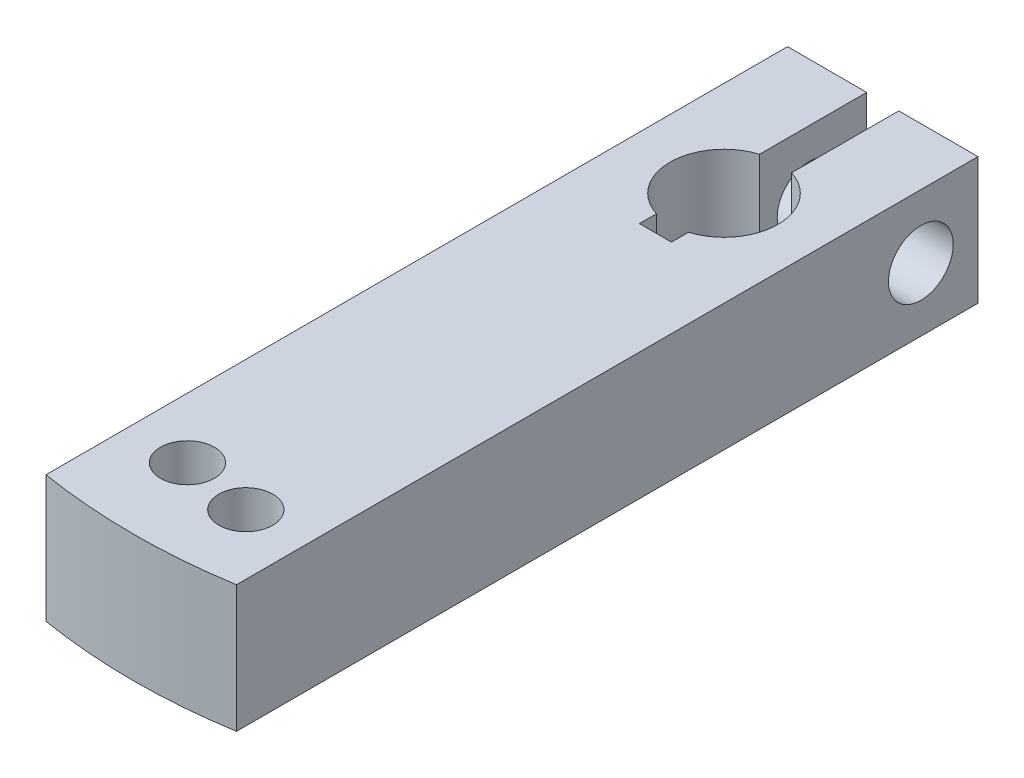
ISO-10303-21;
HEADER;
FILE_DESCRIPTION(('STEP AP214'),'2;1');
FILE_NAME('part.step','',(''),(''),'','','');
FILE_SCHEMA(('AUTOMOTIVE_DESIGN { 1 0 10303 214 1 1 1 1 }'));
ENDSEC;
DATA;
#1=APPLICATION_CONTEXT('core data for automotive mechanical design processes');
#2=APPLICATION_PROTOCOL_DEFINITION('international standard','automotive_design',2000,#1);
#3=PRODUCT_CONTEXT('',#1,'mechanical');
#4=PRODUCT('Part','Part','',(#3));
#5=PRODUCT_RELATED_PRODUCT_CATEGORY('part','',(#4));
#6=PRODUCT_DEFINITION_FORMATION('','',#4);
#7=PRODUCT_DEFINITION_CONTEXT('part definition',#1,'design');
#8=PRODUCT_DEFINITION('design','',#6,#7);
#9=PRODUCT_DEFINITION_SHAPE('','',#8);
#10=(LENGTH_UNIT() NAMED_UNIT(*) SI_UNIT(.MILLI.,.METRE.));
#11=(NAMED_UNIT(*) PLANE_ANGLE_UNIT() SI_UNIT($,.RADIAN.));
#12=(NAMED_UNIT(*) SI_UNIT($,.STERADIAN.) SOLID_ANGLE_UNIT());
#13=UNCERTAINTY_MEASURE_WITH_UNIT(LENGTH_MEASURE(1.E-05),#10,'distance_accuracy_value','');
#14=(GEOMETRIC_REPRESENTATION_CONTEXT(3) GLOBAL_UNCERTAINTY_ASSIGNED_CONTEXT((#13)) GLOBAL_UNIT_ASSIGNED_CONTEXT((#10,
#11,#12)) REPRESENTATION_CONTEXT('',''));
#15=CARTESIAN_POINT('',(0.,0.,0.));
#16=DIRECTION('',(0.,0.,1.));
#17=DIRECTION('',(1.,0.,0.));
#18=AXIS2_PLACEMENT_3D('',#15,#16,#17);
#19=CARTESIAN_POINT('',(15.0000000000022,-10.,-24.9999999999999));
#20=DIRECTION('',(-1.,0.,0.));
#21=DIRECTION('',(0.,0.,1.));
#22=AXIS2_PLACEMENT_3D('',#19,#20,#21);
#23=PLANE('',#22);
#24=CARTESIAN_POINT('',(15.0000000000018,0.,-15.9999999999996));
#25=DIRECTION('',(-1.,0.,0.));
#26=DIRECTION('',(0.,0.,1.));
#27=AXIS2_PLACEMENT_3D('',#24,#25,#26);
#28=CIRCLE('',#27,5.1);
#29=CARTESIAN_POINT('',(15.0000000000018,0.,-10.8999999999996));
#30=VERTEX_POINT('',#29);
#31=EDGE_CURVE('E139',#30,#30,#28,.T.);
#32=ORIENTED_EDGE('',*,*,#31,.T.);
#33=EDGE_LOOP('',(#32));
#34=FACE_BOUND('',#33,.T.);
#35=DIRECTION('',(0.,0.,1.));
#36=VECTOR('',#35,1.);
#37=CARTESIAN_POINT('',(15.0000000000022,10.,-24.9999999999999));
#38=LINE('',#37,#36);
#39=CARTESIAN_POINT('',(15.0000000000022,10.,-24.9999999999999));
#40=VERTEX_POINT('',#39);
#41=CARTESIAN_POINT('',(15.0000000000019,9.9999999999999,91.7823512446701));
#42=VERTEX_POINT('',#41);
#43=EDGE_CURVE('E142',#40,#42,#38,.T.);
#44=ORIENTED_EDGE('',*,*,#43,.T.);
#45=DIRECTION('',(0.,1.,0.));
#46=VECTOR('',#45,1.);
#47=CARTESIAN_POINT('',(15.0000000000019,-10.0000000000001,91.7823512446701));
#48=LINE('',#47,#46);
#49=CARTESIAN_POINT('',(15.0000000000019,-10.0000000000001,91.7823512446701));
#50=VERTEX_POINT('',#49);
#51=EDGE_CURVE('E11',#50,#42,#48,.T.);
#52=ORIENTED_EDGE('',*,*,#51,.F.);
#53=DIRECTION('',(0.,0.,1.));
#54=VECTOR('',#53,1.);
#55=CARTESIAN_POINT('',(15.0000000000022,-10.,-24.9999999999999));
#56=LINE('',#55,#54);
#57=CARTESIAN_POINT('',(15.0000000000022,-10.,-24.9999999999999));
#58=VERTEX_POINT('',#57);
#59=EDGE_CURVE('E176',#58,#50,#56,.T.);
#60=ORIENTED_EDGE('',*,*,#59,.F.);
#61=DIRECTION('',(0.,1.,0.));
#62=VECTOR('',#61,1.);
#63=CARTESIAN_POINT('',(15.0000000000022,-10.,-24.9999999999999));
#64=LINE('',#63,#62);
#65=EDGE_CURVE('E201',#58,#40,#64,.T.);
#66=ORIENTED_EDGE('',*,*,#65,.T.);
#67=EDGE_LOOP('',(#44,#52,#60,#66));
#68=FACE_BOUND('',#67,.T.);
#69=ADVANCED_FACE('F16',(#34,#68),#23,.F.);
#70=CARTESIAN_POINT('',(-1.11022302462516E-13,-10.,0.));
#71=DIRECTION('',(0.,1.,0.));
#72=DIRECTION('',(0.,0.,1.));
#73=AXIS2_PLACEMENT_3D('',#70,#71,#72);
#74=CYLINDRICAL_SURFACE('',#73,93.);
#75=CARTESIAN_POINT('',(-1.11022302462516E-13,10.,0.));
#76=DIRECTION('',(0.,-1.,0.));
#77=DIRECTION('',(1.,0.,0.));
#78=AXIS2_PLACEMENT_3D('',#75,#76,#77);
#79=CIRCLE('',#78,93.);
#80=CARTESIAN_POINT('',(-14.9999999999982,9.9999999999999,91.7823512446714));
#81=VERTEX_POINT('',#80);
#82=EDGE_CURVE('E143',#42,#81,#79,.T.);
#83=ORIENTED_EDGE('',*,*,#82,.T.);
#84=DIRECTION('',(0.,1.,0.));
#85=VECTOR('',#84,1.);
#86=CARTESIAN_POINT('',(-14.9999999999982,-10.0000000000001,91.7823512446714));
#87=LINE('',#86,#85);
#88=CARTESIAN_POINT('',(-14.9999999999982,-10.0000000000001,91.7823512446714));
#89=VERTEX_POINT('',#88);
#90=EDGE_CURVE('E24',#89,#81,#87,.T.);
#91=ORIENTED_EDGE('',*,*,#90,.F.);
#92=CARTESIAN_POINT('',(-1.11022302462516E-13,-10.,0.));
#93=DIRECTION('',(0.,-1.,0.));
#94=DIRECTION('',(1.,0.,0.));
#95=AXIS2_PLACEMENT_3D('',#92,#93,#94);
#96=CIRCLE('',#95,93.);
#97=EDGE_CURVE('E180',#50,#89,#96,.T.);
#98=ORIENTED_EDGE('',*,*,#97,.F.);
#99=ORIENTED_EDGE('',*,*,#51,.T.);
#100=EDGE_LOOP('',(#83,#91,#98,#99));
#101=FACE_BOUND('',#100,.T.);
#102=ADVANCED_FACE('F258',(#101),#74,.T.);
#103=CARTESIAN_POINT('',(-14.9999999999982,-10.,-24.9999999999999));
#104=DIRECTION('',(1.,0.,0.));
#105=DIRECTION('',(0.,0.,-1.));
#106=AXIS2_PLACEMENT_3D('',#103,#104,#105);
#107=PLANE('',#106);
#108=CARTESIAN_POINT('',(-14.999999999998,0.,-15.9999999999991));
#109=DIRECTION('',(1.,0.,0.));
#110=DIRECTION('',(0.,0.,-1.));
#111=AXIS2_PLACEMENT_3D('',#108,#109,#110);
#112=CIRCLE('',#111,5.1);
#113=CARTESIAN_POINT('',(-14.999999999998,0.,-21.0999999999991));
#114=VERTEX_POINT('',#113);
#115=EDGE_CURVE('E136',#114,#114,#112,.T.);
#116=ORIENTED_EDGE('',*,*,#115,.T.);
#117=EDGE_LOOP('',(#116));
#118=FACE_BOUND('',#117,.T.);
#119=DIRECTION('',(0.,0.,-1.));
#120=VECTOR('',#119,1.);
#121=CARTESIAN_POINT('',(-14.9999999999982,10.,-24.9999999999999));
#122=LINE('',#121,#120);
#123=CARTESIAN_POINT('',(-14.9999999999982,10.,-24.9999999999999));
#124=VERTEX_POINT('',#123);
#125=EDGE_CURVE('E146',#81,#124,#122,.T.);
#126=ORIENTED_EDGE('',*,*,#125,.T.);
#127=DIRECTION('',(0.,1.,0.));
#128=VECTOR('',#127,1.);
#129=CARTESIAN_POINT('',(-14.9999999999982,-10.,-24.9999999999999));
#130=LINE('',#129,#128);
#131=CARTESIAN_POINT('',(-14.9999999999982,-10.,-24.9999999999999));
#132=VERTEX_POINT('',#131);
#133=EDGE_CURVE('E229',#132,#124,#130,.T.);
#134=ORIENTED_EDGE('',*,*,#133,.F.);
#135=DIRECTION('',(0.,0.,-1.));
#136=VECTOR('',#135,1.);
#137=CARTESIAN_POINT('',(-14.9999999999982,-10.,-24.9999999999999));
#138=LINE('',#137,#136);
#139=EDGE_CURVE('E182',#89,#132,#138,.T.);
#140=ORIENTED_EDGE('',*,*,#139,.F.);
#141=ORIENTED_EDGE('',*,*,#90,.T.);
#142=EDGE_LOOP('',(#126,#134,#140,#141));
#143=FACE_BOUND('',#142,.T.);
#144=ADVANCED_FACE('F237',(#118,#143),#107,.F.);
#145=CARTESIAN_POINT('',(-14.9999999999982,-10.,-24.9999999999999));
#146=DIRECTION('',(0.,0.,1.));
#147=DIRECTION('',(1.,0.,0.));
#148=AXIS2_PLACEMENT_3D('',#145,#146,#147);
#149=PLANE('',#148);
#150=DIRECTION('',(1.,0.,0.));
#151=VECTOR('',#150,1.);
#152=CARTESIAN_POINT('',(-14.9999999999982,10.,-24.9999999999999));
#153=LINE('',#152,#151);
#154=CARTESIAN_POINT('',(-2.52500000000022,10.,-24.9999999999999));
#155=VERTEX_POINT('',#154);
#156=EDGE_CURVE('E149',#124,#155,#153,.T.);
#157=ORIENTED_EDGE('',*,*,#156,.T.);
#158=DIRECTION('',(0.,1.,0.));
#159=VECTOR('',#158,1.);
#160=CARTESIAN_POINT('',(-2.52500000000022,-9.99999999999995,-24.9999999999999));
#161=LINE('',#160,#159);
#162=CARTESIAN_POINT('',(-2.52500000000022,-9.99999999999995,-24.9999999999999));
#163=VERTEX_POINT('',#162);
#164=EDGE_CURVE('E226',#163,#155,#161,.T.);
#165=ORIENTED_EDGE('',*,*,#164,.F.);
#166=DIRECTION('',(1.,0.,0.));
#167=VECTOR('',#166,1.);
#168=CARTESIAN_POINT('',(-14.9999999999982,-10.,-24.9999999999999));
#169=LINE('',#168,#167);
#170=EDGE_CURVE('E184',#132,#163,#169,.T.);
#171=ORIENTED_EDGE('',*,*,#170,.F.);
#172=ORIENTED_EDGE('',*,*,#133,.T.);
#173=EDGE_LOOP('',(#157,#165,#171,#172));
#174=FACE_BOUND('',#173,.T.);
#175=ADVANCED_FACE('F248',(#174),#149,.F.);
#176=CARTESIAN_POINT('',(-2.52500000000022,-9.99999999999995,-24.9999999999999));
#177=DIRECTION('',(-1.,0.,0.));
#178=DIRECTION('',(0.,0.,1.));
#179=AXIS2_PLACEMENT_3D('',#176,#177,#178);
#180=PLANE('',#179);
#181=CARTESIAN_POINT('',(-2.525,0.,-15.9999999999991));
#182=DIRECTION('',(-1.,0.,0.));
#183=DIRECTION('',(0.,0.,1.));
#184=AXIS2_PLACEMENT_3D('',#181,#182,#183);
#185=CIRCLE('',#184,5.1);
#186=CARTESIAN_POINT('',(-2.52500000000001,0.,-10.8999999999991));
#187=VERTEX_POINT('',#186);
#188=EDGE_CURVE('E133',#187,#187,#185,.T.);
#189=ORIENTED_EDGE('',*,*,#188,.T.);
#190=EDGE_LOOP('',(#189));
#191=FACE_BOUND('',#190,.T.);
#192=DIRECTION('',(0.,0.,1.));
#193=VECTOR('',#192,1.);
#194=CARTESIAN_POINT('',(-2.52500000000022,10.,-24.9999999999999));
#195=LINE('',#194,#193);
#196=CARTESIAN_POINT('',(-2.525,10.,-8.11630303771338));
#197=VERTEX_POINT('',#196);
#198=EDGE_CURVE('E152',#155,#197,#195,.T.);
#199=ORIENTED_EDGE('',*,*,#198,.T.);
#200=DIRECTION('',(0.,1.,0.));
#201=VECTOR('',#200,1.);
#202=CARTESIAN_POINT('',(-2.525,-10.,-8.11630303771338));
#203=LINE('',#202,#201);
#204=CARTESIAN_POINT('',(-2.525,-10.,-8.11630303771338));
#205=VERTEX_POINT('',#204);
#206=EDGE_CURVE('E223',#205,#197,#203,.T.);
#207=ORIENTED_EDGE('',*,*,#206,.F.);
#208=DIRECTION('',(0.,0.,1.));
#209=VECTOR('',#208,1.);
#210=CARTESIAN_POINT('',(-2.52500000000022,-9.99999999999995,-24.9999999999999));
#211=LINE('',#210,#209);
#212=EDGE_CURVE('E186',#163,#205,#211,.T.);
#213=ORIENTED_EDGE('',*,*,#212,.F.);
#214=ORIENTED_EDGE('',*,*,#164,.T.);
#215=EDGE_LOOP('',(#199,#207,#213,#214));
#216=FACE_BOUND('',#215,.T.);
#217=ADVANCED_FACE('F252',(#191,#216),#180,.F.);
#218=CARTESIAN_POINT('',(-1.11022302462516E-13,-10.,0.));
#219=DIRECTION('',(0.,1.,0.));
#220=DIRECTION('',(0.,0.,1.));
#221=AXIS2_PLACEMENT_3D('',#218,#219,#220);
#222=CYLINDRICAL_SURFACE('',#221,8.5);
#223=CARTESIAN_POINT('',(-1.11022302462516E-13,10.,0.));
#224=DIRECTION('',(0.,1.,0.));
#225=DIRECTION('',(1.,0.,0.));
#226=AXIS2_PLACEMENT_3D('',#223,#224,#225);
#227=CIRCLE('',#226,8.5);
#228=CARTESIAN_POINT('',(-2.52500000000044,10.,8.11630303771427));
#229=VERTEX_POINT('',#228);
#230=EDGE_CURVE('E155',#197,#229,#227,.T.);
#231=ORIENTED_EDGE('',*,*,#230,.T.);
#232=DIRECTION('',(0.,1.,0.));
#233=VECTOR('',#232,1.);
#234=CARTESIAN_POINT('',(-2.52500000000044,-10.,8.11630303771427));
#235=LINE('',#234,#233);
#236=CARTESIAN_POINT('',(-2.52500000000044,-10.,8.11630303771427));
#237=VERTEX_POINT('',#236);
#238=EDGE_CURVE('E220',#237,#229,#235,.T.);
#239=ORIENTED_EDGE('',*,*,#238,.F.);
#240=CARTESIAN_POINT('',(-1.11022302462516E-13,-10.,0.));
#241=DIRECTION('',(0.,1.,0.));
#242=DIRECTION('',(1.,0.,0.));
#243=AXIS2_PLACEMENT_3D('',#240,#241,#242);
#244=CIRCLE('',#243,8.5);
#245=EDGE_CURVE('E188',#205,#237,#244,.T.);
#246=ORIENTED_EDGE('',*,*,#245,.F.);
#247=ORIENTED_EDGE('',*,*,#206,.T.);
#248=EDGE_LOOP('',(#231,#239,#246,#247));
#249=FACE_BOUND('',#248,.T.);
#250=ADVANCED_FACE('F289',(#249),#222,.F.);
#251=CARTESIAN_POINT('',(-2.52500000000033,-10.,10.8000000000001));
#252=DIRECTION('',(-1.,0.,0.));
#253=DIRECTION('',(0.,0.,1.));
#254=AXIS2_PLACEMENT_3D('',#251,#252,#253);
#255=PLANE('',#254);
#256=DIRECTION('',(0.,0.,1.));
#257=VECTOR('',#256,1.);
#258=CARTESIAN_POINT('',(-2.52500000000033,10.,10.8000000000001));
#259=LINE('',#258,#257);
#260=CARTESIAN_POINT('',(-2.52500000000033,10.,10.8000000000001));
#261=VERTEX_POINT('',#260);
#262=EDGE_CURVE('E158',#229,#261,#259,.T.);
#263=ORIENTED_EDGE('',*,*,#262,.T.);
#264=DIRECTION('',(0.,1.,0.));
#265=VECTOR('',#264,1.);
#266=CARTESIAN_POINT('',(-2.52500000000033,-10.,10.8000000000001));
#267=LINE('',#266,#265);
#268=CARTESIAN_POINT('',(-2.52500000000033,-10.,10.8000000000001));
#269=VERTEX_POINT('',#268);
#270=EDGE_CURVE('E217',#269,#261,#267,.T.);
#271=ORIENTED_EDGE('',*,*,#270,.F.);
#272=DIRECTION('',(0.,0.,1.));
#273=VECTOR('',#272,1.);
#274=CARTESIAN_POINT('',(-2.52500000000033,-10.,10.8000000000001));
#275=LINE('',#274,#273);
#276=EDGE_CURVE('E190',#237,#269,#275,.T.);
#277=ORIENTED_EDGE('',*,*,#276,.F.);
#278=ORIENTED_EDGE('',*,*,#238,.T.);
#279=EDGE_LOOP('',(#263,#271,#277,#278));
#280=FACE_BOUND('',#279,.T.);
#281=ADVANCED_FACE('F287',(#280),#255,.F.);
#282=CARTESIAN_POINT('',(-2.52500000000033,-10.,10.8000000000001));
#283=DIRECTION('',(0.,0.,1.));
#284=DIRECTION('',(1.,0.,0.));
#285=AXIS2_PLACEMENT_3D('',#282,#283,#284);
#286=PLANE('',#285);
#287=DIRECTION('',(1.,0.,0.));
#288=VECTOR('',#287,1.);
#289=CARTESIAN_POINT('',(-2.52500000000033,10.,10.8000000000001));
#290=LINE('',#289,#288);
#291=CARTESIAN_POINT('',(2.52499999999956,10.,10.800000000001));
#292=VERTEX_POINT('',#291);
#293=EDGE_CURVE('E161',#261,#292,#290,.T.);
#294=ORIENTED_EDGE('',*,*,#293,.T.);
#295=DIRECTION('',(0.,1.,0.));
#296=VECTOR('',#295,1.);
#297=CARTESIAN_POINT('',(2.52499999999956,-10.,10.800000000001));
#298=LINE('',#297,#296);
#299=CARTESIAN_POINT('',(2.52499999999956,-10.,10.800000000001));
#300=VERTEX_POINT('',#299);
#301=EDGE_CURVE('E214',#300,#292,#298,.T.);
#302=ORIENTED_EDGE('',*,*,#301,.F.);
#303=DIRECTION('',(1.,0.,0.));
#304=VECTOR('',#303,1.);
#305=CARTESIAN_POINT('',(-2.52500000000033,-10.,10.8000000000001));
#306=LINE('',#305,#304);
#307=EDGE_CURVE('E192',#269,#300,#306,.T.);
#308=ORIENTED_EDGE('',*,*,#307,.F.);
#309=ORIENTED_EDGE('',*,*,#270,.T.);
#310=EDGE_LOOP('',(#294,#302,#308,#309));
#311=FACE_BOUND('',#310,.T.);
#312=ADVANCED_FACE('F283',(#311),#286,.F.);
#313=CARTESIAN_POINT('',(2.52499999999956,-10.,10.800000000001));
#314=DIRECTION('',(1.,0.,0.));
#315=DIRECTION('',(0.,0.,-1.));
#316=AXIS2_PLACEMENT_3D('',#313,#314,#315);
#317=PLANE('',#316);
#318=DIRECTION('',(0.,0.,-1.));
#319=VECTOR('',#318,1.);
#320=CARTESIAN_POINT('',(2.52499999999956,10.,10.800000000001));
#321=LINE('',#320,#319);
#322=CARTESIAN_POINT('',(2.525,10.,8.11630303771427));
#323=VERTEX_POINT('',#322);
#324=EDGE_CURVE('E164',#292,#323,#321,.T.);
#325=ORIENTED_EDGE('',*,*,#324,.T.);
#326=DIRECTION('',(0.,1.,0.));
#327=VECTOR('',#326,1.);
#328=CARTESIAN_POINT('',(2.525,-10.,8.11630303771427));
#329=LINE('',#328,#327);
#330=CARTESIAN_POINT('',(2.525,-10.,8.11630303771427));
#331=VERTEX_POINT('',#330);
#332=EDGE_CURVE('E211',#331,#323,#329,.T.);
#333=ORIENTED_EDGE('',*,*,#332,.F.);
#334=DIRECTION('',(0.,0.,-1.));
#335=VECTOR('',#334,1.);
#336=CARTESIAN_POINT('',(2.52499999999956,-10.,10.800000000001));
#337=LINE('',#336,#335);
#338=EDGE_CURVE('E194',#300,#331,#337,.T.);
#339=ORIENTED_EDGE('',*,*,#338,.F.);
#340=ORIENTED_EDGE('',*,*,#301,.T.);
#341=EDGE_LOOP('',(#325,#333,#339,#340));
#342=FACE_BOUND('',#341,.T.);
#343=ADVANCED_FACE('F278',(#342),#317,.F.);
#344=CARTESIAN_POINT('',(-1.11022302462516E-13,-10.,0.));
#345=DIRECTION('',(0.,1.,0.));
#346=DIRECTION('',(0.,0.,1.));
#347=AXIS2_PLACEMENT_3D('',#344,#345,#346);
#348=CYLINDRICAL_SURFACE('',#347,8.5);
#349=CARTESIAN_POINT('',(-1.11022302462516E-13,10.,0.));
#350=DIRECTION('',(0.,1.,0.));
#351=DIRECTION('',(-1.,0.,0.));
#352=AXIS2_PLACEMENT_3D('',#349,#350,#351);
#353=CIRCLE('',#352,8.5);
#354=CARTESIAN_POINT('',(2.525,10.,-8.11630303771294));
#355=VERTEX_POINT('',#354);
#356=EDGE_CURVE('E167',#323,#355,#353,.T.);
#357=ORIENTED_EDGE('',*,*,#356,.T.);
#358=DIRECTION('',(0.,1.,0.));
#359=VECTOR('',#358,1.);
#360=CARTESIAN_POINT('',(2.525,-10.,-8.11630303771294));
#361=LINE('',#360,#359);
#362=CARTESIAN_POINT('',(2.525,-10.,-8.11630303771294));
#363=VERTEX_POINT('',#362);
#364=EDGE_CURVE('E208',#363,#355,#361,.T.);
#365=ORIENTED_EDGE('',*,*,#364,.F.);
#366=CARTESIAN_POINT('',(-1.11022302462516E-13,-10.,0.));
#367=DIRECTION('',(0.,1.,0.));
#368=DIRECTION('',(-1.,0.,0.));
#369=AXIS2_PLACEMENT_3D('',#366,#367,#368);
#370=CIRCLE('',#369,8.5);
#371=EDGE_CURVE('E196',#331,#363,#370,.T.);
#372=ORIENTED_EDGE('',*,*,#371,.F.);
#373=ORIENTED_EDGE('',*,*,#332,.T.);
#374=EDGE_LOOP('',(#357,#365,#372,#373));
#375=FACE_BOUND('',#374,.T.);
#376=ADVANCED_FACE('F272',(#375),#348,.F.);
#377=CARTESIAN_POINT('',(2.52499999999956,-10.,-24.9999999999995));
#378=DIRECTION('',(1.,0.,0.));
#379=DIRECTION('',(0.,0.,-1.));
#380=AXIS2_PLACEMENT_3D('',#377,#378,#379);
#381=PLANE('',#380);
#382=CARTESIAN_POINT('',(2.52499999999978,0.,-15.9999999999996));
#383=DIRECTION('',(1.,0.,0.));
#384=DIRECTION('',(0.,0.,-1.));
#385=AXIS2_PLACEMENT_3D('',#382,#383,#384);
#386=CIRCLE('',#385,5.1);
#387=CARTESIAN_POINT('',(2.52499999999979,0.,-21.0999999999996));
#388=VERTEX_POINT('',#387);
#389=EDGE_CURVE('E19',#388,#388,#386,.T.);
#390=ORIENTED_EDGE('',*,*,#389,.T.);
#391=EDGE_LOOP('',(#390));
#392=FACE_BOUND('',#391,.T.);
#393=DIRECTION('',(0.,0.,-1.));
#394=VECTOR('',#393,1.);
#395=CARTESIAN_POINT('',(2.52499999999956,10.,-24.9999999999995));
#396=LINE('',#395,#394);
#397=CARTESIAN_POINT('',(2.52499999999956,10.,-24.9999999999995));
#398=VERTEX_POINT('',#397);
#399=EDGE_CURVE('E170',#355,#398,#396,.T.);
#400=ORIENTED_EDGE('',*,*,#399,.T.);
#401=DIRECTION('',(0.,1.,0.));
#402=VECTOR('',#401,1.);
#403=CARTESIAN_POINT('',(2.52499999999956,-10.,-24.9999999999995));
#404=LINE('',#403,#402);
#405=CARTESIAN_POINT('',(2.52499999999956,-10.,-24.9999999999995));
#406=VERTEX_POINT('',#405);
#407=EDGE_CURVE('E205',#406,#398,#404,.T.);
#408=ORIENTED_EDGE('',*,*,#407,.F.);
#409=DIRECTION('',(0.,0.,-1.));
#410=VECTOR('',#409,1.);
#411=CARTESIAN_POINT('',(2.52499999999956,-10.,-24.9999999999995));
#412=LINE('',#411,#410);
#413=EDGE_CURVE('E198',#363,#406,#412,.T.);
#414=ORIENTED_EDGE('',*,*,#413,.F.);
#415=ORIENTED_EDGE('',*,*,#364,.T.);
#416=EDGE_LOOP('',(#400,#408,#414,#415));
#417=FACE_BOUND('',#416,.T.);
#418=ADVANCED_FACE('F268',(#392,#417),#381,.F.);
#419=CARTESIAN_POINT('',(2.52499999999956,-10.,-24.9999999999995));
#420=DIRECTION('',(0.,0.,1.));
#421=DIRECTION('',(1.,0.,0.));
#422=AXIS2_PLACEMENT_3D('',#419,#420,#421);
#423=PLANE('',#422);
#424=DIRECTION('',(1.,0.,0.));
#425=VECTOR('',#424,1.);
#426=CARTESIAN_POINT('',(2.52499999999956,10.,-24.9999999999995));
#427=LINE('',#426,#425);
#428=EDGE_CURVE('E173',#398,#40,#427,.T.);
#429=ORIENTED_EDGE('',*,*,#428,.T.);
#430=ORIENTED_EDGE('',*,*,#65,.F.);
#431=DIRECTION('',(1.,0.,0.));
#432=VECTOR('',#431,1.);
#433=CARTESIAN_POINT('',(2.52499999999956,-10.,-24.9999999999995));
#434=LINE('',#433,#432);
#435=EDGE_CURVE('E38',#406,#58,#434,.T.);
#436=ORIENTED_EDGE('',*,*,#435,.F.);
#437=ORIENTED_EDGE('',*,*,#407,.T.);
#438=EDGE_LOOP('',(#429,#430,#436,#437));
#439=FACE_BOUND('',#438,.T.);
#440=ADVANCED_FACE('F264',(#439),#423,.F.);
#441=CARTESIAN_POINT('',(-1.11022302462516E-13,-10.,0.));
#442=DIRECTION('',(0.,-1.,0.));
#443=DIRECTION('',(0.,0.,-1.));
#444=AXIS2_PLACEMENT_3D('',#441,#442,#443);
#445=PLANE('',#444);
#446=CARTESIAN_POINT('',(-5.50000000000006,-10.0000000000001,79.0087969785649));
#447=DIRECTION('',(0.,1.,0.));
#448=DIRECTION('',(0.,0.,1.));
#449=AXIS2_PLACEMENT_3D('',#446,#447,#448);
#450=CIRCLE('',#449,8.);
#451=CARTESIAN_POINT('',(0.928918912111443,-10.0000000000001,74.2475994798788));
#452=VERTEX_POINT('',#451);
#453=CARTESIAN_POINT('',(-0.928918912112109,-10.0000000000001,85.5742533745776));
#454=VERTEX_POINT('',#453);
#455=EDGE_CURVE('E30',#452,#454,#450,.T.);
#456=ORIENTED_EDGE('',*,*,#455,.T.);
#457=CARTESIAN_POINT('',(5.49999999999984,-10.0000000000001,80.8130558758919));
#458=DIRECTION('',(0.,1.,0.));
#459=DIRECTION('',(0.,0.,1.));
#460=AXIS2_PLACEMENT_3D('',#457,#458,#459);
#461=CIRCLE('',#460,8.);
#462=EDGE_CURVE('E118',#454,#452,#461,.T.);
#463=ORIENTED_EDGE('',*,*,#462,.T.);
#464=EDGE_LOOP('',(#456,#463));
#465=FACE_BOUND('',#464,.T.);
#466=ORIENTED_EDGE('',*,*,#59,.T.);
#467=ORIENTED_EDGE('',*,*,#97,.T.);
#468=ORIENTED_EDGE('',*,*,#139,.T.);
#469=ORIENTED_EDGE('',*,*,#170,.T.);
#470=ORIENTED_EDGE('',*,*,#212,.T.);
#471=ORIENTED_EDGE('',*,*,#245,.T.);
#472=ORIENTED_EDGE('',*,*,#276,.T.);
#473=ORIENTED_EDGE('',*,*,#307,.T.);
#474=ORIENTED_EDGE('',*,*,#338,.T.);
#475=ORIENTED_EDGE('',*,*,#371,.T.);
#476=ORIENTED_EDGE('',*,*,#413,.T.);
#477=ORIENTED_EDGE('',*,*,#435,.T.);
#478=EDGE_LOOP('',(#466,#467,#468,#469,#470,#471,#472,#473,#474,#475,#476,#477));
#479=FACE_BOUND('',#478,.T.);
#480=ADVANCED_FACE('F117',(#465,#479),#445,.T.);
#481=CARTESIAN_POINT('',(-1.11022302462516E-13,10.,0.));
#482=DIRECTION('',(0.,-1.,0.));
#483=DIRECTION('',(0.,0.,-1.));
#484=AXIS2_PLACEMENT_3D('',#481,#482,#483);
#485=PLANE('',#484);
#486=CARTESIAN_POINT('',(-5.50000000000006,9.9999999999999,79.0087969785649));
#487=DIRECTION('',(0.,-1.,0.));
#488=DIRECTION('',(0.,0.,-1.));
#489=AXIS2_PLACEMENT_3D('',#486,#487,#488);
#490=CIRCLE('',#489,4.25);
#491=CARTESIAN_POINT('',(-5.50000000000005,9.9999999999999,74.7587969785649));
#492=VERTEX_POINT('',#491);
#493=EDGE_CURVE('E114',#492,#492,#490,.T.);
#494=ORIENTED_EDGE('',*,*,#493,.T.);
#495=EDGE_LOOP('',(#494));
#496=FACE_BOUND('',#495,.T.);
#497=CARTESIAN_POINT('',(5.50000000000006,9.9999999999999,80.8130558758919));
#498=DIRECTION('',(0.,-1.,0.));
#499=DIRECTION('',(0.,0.,-1.));
#500=AXIS2_PLACEMENT_3D('',#497,#498,#499);
#501=CIRCLE('',#500,4.25);
#502=CARTESIAN_POINT('',(5.50000000000007,9.9999999999999,76.5630558758919));
#503=VERTEX_POINT('',#502);
#504=EDGE_CURVE('E123',#503,#503,#501,.T.);
#505=ORIENTED_EDGE('',*,*,#504,.T.);
#506=EDGE_LOOP('',(#505));
#507=FACE_BOUND('',#506,.T.);
#508=ORIENTED_EDGE('',*,*,#43,.F.);
#509=ORIENTED_EDGE('',*,*,#428,.F.);
#510=ORIENTED_EDGE('',*,*,#399,.F.);
#511=ORIENTED_EDGE('',*,*,#356,.F.);
#512=ORIENTED_EDGE('',*,*,#324,.F.);
#513=ORIENTED_EDGE('',*,*,#293,.F.);
#514=ORIENTED_EDGE('',*,*,#262,.F.);
#515=ORIENTED_EDGE('',*,*,#230,.F.);
#516=ORIENTED_EDGE('',*,*,#198,.F.);
#517=ORIENTED_EDGE('',*,*,#156,.F.);
#518=ORIENTED_EDGE('',*,*,#125,.F.);
#519=ORIENTED_EDGE('',*,*,#82,.F.);
#520=EDGE_LOOP('',(#508,#509,#510,#511,#512,#513,#514,#515,#516,#517,#518,#519));
#521=FACE_BOUND('',#520,.T.);
#522=ADVANCED_FACE('F243',(#496,#507,#521),#485,.F.);
#523=CARTESIAN_POINT('',(-1.11022302462516E-13,0.,-16.));
#524=DIRECTION('',(1.,0.,0.));
#525=DIRECTION('',(0.,0.,1.));
#526=AXIS2_PLACEMENT_3D('',#523,#524,#525);
#527=CYLINDRICAL_SURFACE('',#526,5.1);
#528=ORIENTED_EDGE('',*,*,#389,.F.);
#529=EDGE_LOOP('',(#528));
#530=FACE_BOUND('',#529,.T.);
#531=ORIENTED_EDGE('',*,*,#31,.F.);
#532=EDGE_LOOP('',(#531));
#533=FACE_BOUND('',#532,.T.);
#534=ADVANCED_FACE('F307',(#530,#533),#527,.F.);
#535=ORIENTED_EDGE('',*,*,#188,.F.);
#536=EDGE_LOOP('',(#535));
#537=FACE_BOUND('',#536,.T.);
#538=ORIENTED_EDGE('',*,*,#115,.F.);
#539=EDGE_LOOP('',(#538));
#540=FACE_BOUND('',#539,.T.);
#541=ADVANCED_FACE('F309',(#537,#540),#527,.F.);
#542=CARTESIAN_POINT('',(5.49999999999984,117.135574521497,80.8130558758919));
#543=DIRECTION('',(0.,-1.,0.));
#544=DIRECTION('',(0.,0.,-1.));
#545=AXIS2_PLACEMENT_3D('',#542,#543,#544);
#546=CYLINDRICAL_SURFACE('',#545,4.25);
#547=ORIENTED_EDGE('',*,*,#504,.F.);
#548=EDGE_LOOP('',(#547));
#549=FACE_BOUND('',#548,.T.);
#550=CARTESIAN_POINT('',(5.49999999999984,-6.25000000000009,80.8130558758919));
#551=DIRECTION('',(0.,-1.,0.));
#552=DIRECTION('',(0.,0.,1.));
#553=AXIS2_PLACEMENT_3D('',#550,#551,#552);
#554=CIRCLE('',#553,4.25);
#555=CARTESIAN_POINT('',(5.49999999999983,-6.25000000000009,85.0630558758919));
#556=VERTEX_POINT('',#555);
#557=EDGE_CURVE('E124',#556,#556,#554,.T.);
#558=ORIENTED_EDGE('',*,*,#557,.T.);
#559=EDGE_LOOP('',(#558));
#560=FACE_BOUND('',#559,.T.);
#561=ADVANCED_FACE('F316',(#549,#560),#546,.F.);
#562=CARTESIAN_POINT('',(5.49999999999984,-10.0000000000001,80.8130558758919));
#563=DIRECTION('',(0.,-1.,0.));
#564=DIRECTION('',(0.,0.,1.));
#565=AXIS2_PLACEMENT_3D('',#562,#563,#564);
#566=CONICAL_SURFACE('',#565,8.,0.785398163397448);
#567=ORIENTED_EDGE('',*,*,#462,.F.);
#568=CARTESIAN_POINT('',(-0.928964037367419,-10.0002000000001,85.574528489091));
#569=CARTESIAN_POINT('',(-0.903590671466844,-9.88777607121838,85.4198350438672));
#570=CARTESIAN_POINT('',(-0.878048740419949,-9.77677378430406,85.264113909871));
#571=CARTESIAN_POINT('',(-0.826558574159162,-9.55828960840326,84.9501945329419));
#572=CARTESIAN_POINT('',(-0.800610176607812,-9.45080918187379,84.7919953002885));
#573=CARTESIAN_POINT('',(-0.747948601516322,-9.23889168551105,84.4709342115141));
#574=CARTESIAN_POINT('',(-0.721230006017616,-9.13450573688357,84.3080393238009));
#575=CARTESIAN_POINT('',(-0.667260789985538,-8.93115243120607,83.979005958782));
#576=CARTESIAN_POINT('',(-0.640010226268807,-8.83218449973604,83.8128678278696));
#577=CARTESIAN_POINT('',(-0.583868430673673,-8.63736393908761,83.4705889273962));
#578=CARTESIAN_POINT('',(-0.554953881138931,-8.54176428431739,83.2943059974056));
#579=CARTESIAN_POINT('',(-0.496391806342602,-8.35960179872567,82.9372714145563));
#580=CARTESIAN_POINT('',(-0.466744140743572,-8.27304071494576,82.7565189061041));
#581=CARTESIAN_POINT('',(-0.3768522441922,-8.0310929371223,82.2084762368778));
#582=CARTESIAN_POINT('',(-0.315337159143778,-7.89226894600683,81.8334380776984));
#583=CARTESIAN_POINT('',(-0.222694423063914,-7.73808889668087,81.2686244035711));
#584=CARTESIAN_POINT('',(-0.19271017648701,-7.69626958842823,81.0858198665766));
#585=CARTESIAN_POINT('',(-0.132223265877139,-7.63004318140336,80.7170501641282));
#586=CARTESIAN_POINT('',(-0.101720519129373,-7.60563888799919,80.531084494388));
#587=CARTESIAN_POINT('',(-0.0409344404277633,-7.57613687435708,80.1604908580156));
#588=CARTESIAN_POINT('',(-0.0106548153099781,-7.57075147460337,79.9758854907991));
#589=CARTESIAN_POINT('',(0.0498368883922933,-7.57886508556341,79.6070865663695));
#590=CARTESIAN_POINT('',(0.0800489675569707,-7.59236393344039,79.4228930056192));
#591=CARTESIAN_POINT('',(0.139953070335483,-7.63718599008519,79.0576764995292));
#592=CARTESIAN_POINT('',(0.169647014406108,-7.66841318630117,78.8766418457674));
#593=CARTESIAN_POINT('',(0.228477064930279,-7.74672303138025,78.5179734990446));
#594=CARTESIAN_POINT('',(0.257613088394852,-7.7938080199743,78.3403403120414));
#595=CARTESIAN_POINT('',(0.315629485906678,-7.90226553091368,77.986632552265));
#596=CARTESIAN_POINT('',(0.344500127322376,-7.96383414397061,77.8106173162905));
#597=CARTESIAN_POINT('',(0.401521881296517,-8.09844531685643,77.462973585867));
#598=CARTESIAN_POINT('',(0.429673009774195,-8.17148762257373,77.2913449943633));
#599=CARTESIAN_POINT('',(0.500058580599826,-8.36814809119602,76.8622262685364));
#600=CARTESIAN_POINT('',(0.541832801883311,-8.49802534724946,76.6075419575449));
#601=CARTESIAN_POINT('',(0.624015755394591,-8.77358167722179,76.1064982935998));
#602=CARTESIAN_POINT('',(0.66442321787193,-8.91927494291493,75.8601466819159));
#603=CARTESIAN_POINT('',(0.723471981492479,-9.14377658755897,75.5001449101145));
#604=CARTESIAN_POINT('',(0.742557299552534,-9.21818618323236,75.383787718266));
#605=CARTESIAN_POINT('',(0.780485763616568,-9.36933607864475,75.1525497815584));
#606=CARTESIAN_POINT('',(0.799328902440323,-9.4460764472616,75.0376690804748));
#607=CARTESIAN_POINT('',(0.836751506580933,-9.60138586882245,74.8095152128914));
#608=CARTESIAN_POINT('',(0.85533148932852,-9.67995017727893,74.696238891779));
#609=CARTESIAN_POINT('',(0.892291756610192,-9.83882512719703,74.4709037468615));
#610=CARTESIAN_POINT('',(0.910672063987078,-9.91913556567869,74.3588447837911));
#611=CARTESIAN_POINT('',(0.928964037366864,-10.0002000000001,74.2473243653667));
#612=B_SPLINE_CURVE_WITH_KNOTS('',3,(#568,#569,#570,#571,#572,#573,#574,#575,#576,#577,#578,
#579,#580,#581,#582,#583,#584,#585,#586,#587,#588,#589,#590,#591,#592,#593,#594,#595,#596,#597,
#598,#599,#600,#601,#602,#603,#604,#605,#606,#607,#608,#609,#610,#611),.UNSPECIFIED.,.F.,.F.,(4,
2,2,2,2,2,2,2,2,2,2,2,2,2,2,2,2,2,2,2,2,4),(0.,0.57873822357906,1.15771379943687,
1.74354658578694,2.3293171411832,2.9368855930404,3.54457126366385,4.75304444806969,
5.32209901271839,5.89124522514086,6.45174476932245,7.01223948040855,7.56972725230311,
8.12729731454485,8.69290129123789,9.25849274308142,10.1244468874022,10.9911845812526,
11.4094460057219,11.8277198024965,12.245006209777,12.6622443659803),.UNSPECIFIED.);
#613=EDGE_CURVE('E109',#454,#452,#612,.T.);
#614=ORIENTED_EDGE('',*,*,#613,.T.);
#615=EDGE_LOOP('',(#567,#614));
#616=FACE_BOUND('',#615,.T.);
#617=ORIENTED_EDGE('',*,*,#557,.F.);
#618=EDGE_LOOP('',(#617));
#619=FACE_BOUND('',#618,.T.);
#620=ADVANCED_FACE('F121',(#616,#619),#566,.F.);
#621=CARTESIAN_POINT('',(-5.50000000000006,117.135574521497,79.0087969785649));
#622=DIRECTION('',(0.,-1.,0.));
#623=DIRECTION('',(0.,0.,-1.));
#624=AXIS2_PLACEMENT_3D('',#621,#622,#623);
#625=CYLINDRICAL_SURFACE('',#624,4.25);
#626=ORIENTED_EDGE('',*,*,#493,.F.);
#627=EDGE_LOOP('',(#626));
#628=FACE_BOUND('',#627,.T.);
#629=CARTESIAN_POINT('',(-5.50000000000006,-6.25000000000014,79.0087969785649));
#630=DIRECTION('',(0.,-1.,0.));
#631=DIRECTION('',(0.,0.,1.));
#632=AXIS2_PLACEMENT_3D('',#629,#630,#631);
#633=CIRCLE('',#632,4.25);
#634=CARTESIAN_POINT('',(-5.50000000000007,-6.25000000000014,83.2587969785649));
#635=VERTEX_POINT('',#634);
#636=EDGE_CURVE('E119',#635,#635,#633,.T.);
#637=ORIENTED_EDGE('',*,*,#636,.T.);
#638=EDGE_LOOP('',(#637));
#639=FACE_BOUND('',#638,.T.);
#640=ADVANCED_FACE('F403',(#628,#639),#625,.F.);
#641=CARTESIAN_POINT('',(-5.50000000000006,-10.0000000000001,79.0087969785649));
#642=DIRECTION('',(0.,-1.,0.));
#643=DIRECTION('',(0.,0.,1.));
#644=AXIS2_PLACEMENT_3D('',#641,#642,#643);
#645=CONICAL_SURFACE('',#644,8.,0.785398163397448);
#646=ORIENTED_EDGE('',*,*,#636,.F.);
#647=EDGE_LOOP('',(#646));
#648=FACE_BOUND('',#647,.T.);
#649=ORIENTED_EDGE('',*,*,#455,.F.);
#650=ORIENTED_EDGE('',*,*,#613,.F.);
#651=EDGE_LOOP('',(#649,#650));
#652=FACE_BOUND('',#651,.T.);
#653=ADVANCED_FACE('F110',(#648,#652),#645,.F.);
#654=CLOSED_SHELL('',(#69,#102,#144,#175,#217,#250,#281,#312,#343,#376,#418,#440,#480,#522,#534,
#541,#561,#620,#640,#653));
#655=MANIFOLD_SOLID_BREP('B1',#654);
#656=ADVANCED_BREP_SHAPE_REPRESENTATION('',(#18,#655),#14);
#657=SHAPE_DEFINITION_REPRESENTATION(#9,#656);
ENDSEC;
END-ISO-10303-21;
